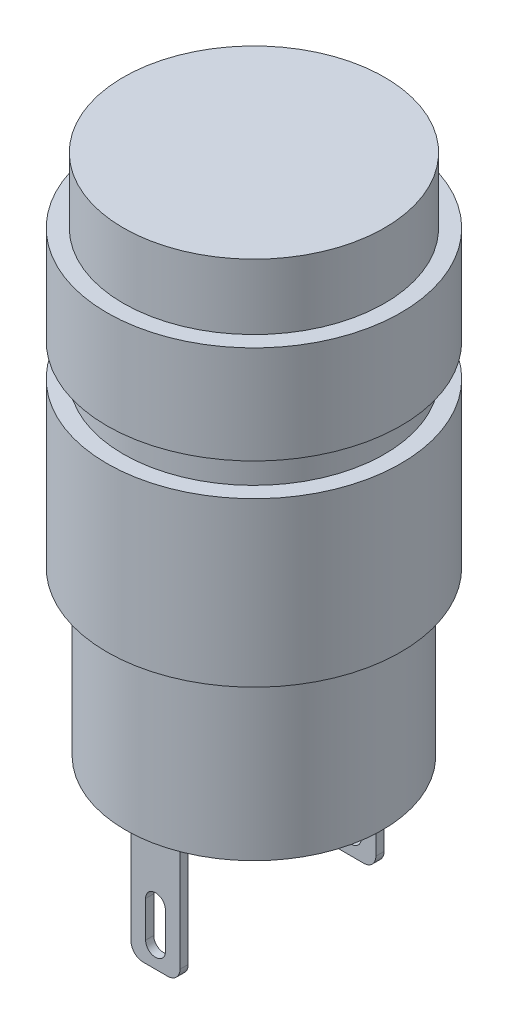
ISO-10303-21;
HEADER;
FILE_DESCRIPTION(('STEP AP214'),'2;1');
FILE_NAME('part.step','',(''),(''),'','','');
FILE_SCHEMA(('AUTOMOTIVE_DESIGN { 1 0 10303 214 1 1 1 1 }'));
ENDSEC;
DATA;
#1=APPLICATION_CONTEXT('core data for automotive mechanical design processes');
#2=APPLICATION_PROTOCOL_DEFINITION('international standard','automotive_design',2000,#1);
#3=PRODUCT_CONTEXT('',#1,'mechanical');
#4=PRODUCT('Part','Part','',(#3));
#5=PRODUCT_RELATED_PRODUCT_CATEGORY('part','',(#4));
#6=PRODUCT_DEFINITION_FORMATION('','',#4);
#7=PRODUCT_DEFINITION_CONTEXT('part definition',#1,'design');
#8=PRODUCT_DEFINITION('design','',#6,#7);
#9=PRODUCT_DEFINITION_SHAPE('','',#8);
#10=(LENGTH_UNIT() NAMED_UNIT(*) SI_UNIT(.MILLI.,.METRE.));
#11=(NAMED_UNIT(*) PLANE_ANGLE_UNIT() SI_UNIT($,.RADIAN.));
#12=(NAMED_UNIT(*) SI_UNIT($,.STERADIAN.) SOLID_ANGLE_UNIT());
#13=UNCERTAINTY_MEASURE_WITH_UNIT(LENGTH_MEASURE(1.E-05),#10,'distance_accuracy_value','');
#14=(GEOMETRIC_REPRESENTATION_CONTEXT(3) GLOBAL_UNCERTAINTY_ASSIGNED_CONTEXT((#13)) GLOBAL_UNIT_ASSIGNED_CONTEXT((#10,
#11,#12)) REPRESENTATION_CONTEXT('',''));
#15=CARTESIAN_POINT('',(0.,0.,0.));
#16=DIRECTION('',(0.,0.,1.));
#17=DIRECTION('',(1.,0.,0.));
#18=AXIS2_PLACEMENT_3D('',#15,#16,#17);
#19=CARTESIAN_POINT('',(0.,20.,0.));
#20=DIRECTION('',(0.,1.,0.));
#21=DIRECTION('',(0.,0.,1.));
#22=AXIS2_PLACEMENT_3D('',#19,#20,#21);
#23=PLANE('',#22);
#24=CARTESIAN_POINT('',(0.,20.,0.));
#25=DIRECTION('',(0.,1.,0.));
#26=DIRECTION('',(0.,0.,1.));
#27=AXIS2_PLACEMENT_3D('',#24,#25,#26);
#28=CIRCLE('',#27,9.);
#29=CARTESIAN_POINT('',(0.,20.,9.));
#30=VERTEX_POINT('',#29);
#31=EDGE_CURVE('E11',#30,#30,#28,.T.);
#32=ORIENTED_EDGE('',*,*,#31,.T.);
#33=EDGE_LOOP('',(#32));
#34=FACE_BOUND('',#33,.T.);
#35=CARTESIAN_POINT('',(0.,20.,0.));
#36=DIRECTION('',(0.,1.,0.));
#37=DIRECTION('',(0.,0.,1.));
#38=AXIS2_PLACEMENT_3D('',#35,#36,#37);
#39=CIRCLE('',#38,8.);
#40=CARTESIAN_POINT('',(0.,20.,8.));
#41=VERTEX_POINT('',#40);
#42=EDGE_CURVE('E59',#41,#41,#39,.T.);
#43=ORIENTED_EDGE('',*,*,#42,.F.);
#44=EDGE_LOOP('',(#43));
#45=FACE_BOUND('',#44,.T.);
#46=ADVANCED_FACE('F48',(#34,#45),#23,.T.);
#47=CARTESIAN_POINT('',(0.,10.,0.));
#48=DIRECTION('',(0.,1.,0.));
#49=DIRECTION('',(0.,0.,1.));
#50=AXIS2_PLACEMENT_3D('',#47,#48,#49);
#51=PLANE('',#50);
#52=CARTESIAN_POINT('',(0.,10.,0.));
#53=DIRECTION('',(0.,1.,0.));
#54=DIRECTION('',(0.,0.,1.));
#55=AXIS2_PLACEMENT_3D('',#52,#53,#54);
#56=CIRCLE('',#55,9.);
#57=CARTESIAN_POINT('',(0.,10.,9.));
#58=VERTEX_POINT('',#57);
#59=EDGE_CURVE('E52',#58,#58,#56,.T.);
#60=ORIENTED_EDGE('',*,*,#59,.F.);
#61=EDGE_LOOP('',(#60));
#62=FACE_BOUND('',#61,.T.);
#63=CARTESIAN_POINT('',(0.,10.,0.));
#64=DIRECTION('',(0.,1.,0.));
#65=DIRECTION('',(0.,0.,1.));
#66=AXIS2_PLACEMENT_3D('',#63,#64,#65);
#67=CIRCLE('',#66,8.);
#68=CARTESIAN_POINT('',(0.,10.,8.));
#69=VERTEX_POINT('',#68);
#70=EDGE_CURVE('E61',#69,#69,#67,.T.);
#71=ORIENTED_EDGE('',*,*,#70,.T.);
#72=EDGE_LOOP('',(#71));
#73=FACE_BOUND('',#72,.T.);
#74=ADVANCED_FACE('F71',(#62,#73),#51,.F.);
#75=CARTESIAN_POINT('',(0.,20.,0.));
#76=DIRECTION('',(0.,-1.,0.));
#77=DIRECTION('',(0.,0.,-1.));
#78=AXIS2_PLACEMENT_3D('',#75,#76,#77);
#79=CYLINDRICAL_SURFACE('',#78,9.);
#80=ORIENTED_EDGE('',*,*,#31,.F.);
#81=EDGE_LOOP('',(#80));
#82=FACE_BOUND('',#81,.T.);
#83=ORIENTED_EDGE('',*,*,#59,.T.);
#84=EDGE_LOOP('',(#83));
#85=FACE_BOUND('',#84,.T.);
#86=ADVANCED_FACE('F50',(#82,#85),#79,.T.);
#87=CARTESIAN_POINT('',(0.,20.,0.));
#88=DIRECTION('',(0.,-1.,0.));
#89=DIRECTION('',(0.,0.,-1.));
#90=AXIS2_PLACEMENT_3D('',#87,#88,#89);
#91=CYLINDRICAL_SURFACE('',#90,8.);
#92=ORIENTED_EDGE('',*,*,#42,.T.);
#93=EDGE_LOOP('',(#92));
#94=FACE_BOUND('',#93,.T.);
#95=ORIENTED_EDGE('',*,*,#70,.F.);
#96=EDGE_LOOP('',(#95));
#97=FACE_BOUND('',#96,.T.);
#98=ADVANCED_FACE('F67',(#94,#97),#91,.F.);
#99=CLOSED_SHELL('',(#46,#74,#86,#98));
#100=MANIFOLD_SOLID_BREP('B2',#99);
#101=CARTESIAN_POINT('',(-1.18951139985828,-8.,-5.65902569259941));
#102=DIRECTION('',(0.,0.,1.));
#103=DIRECTION('',(1.,0.,0.));
#104=AXIS2_PLACEMENT_3D('',#101,#102,#103);
#105=PLANE('',#104);
#106=DIRECTION('',(0.,1.,0.));
#107=VECTOR('',#106,1.);
#108=CARTESIAN_POINT('',(-1.18951139985828,-8.,-5.65902569259941));
#109=LINE('',#108,#107);
#110=CARTESIAN_POINT('',(-1.18951139985828,-7.25,-5.65902569259941));
#111=VERTEX_POINT('',#110);
#112=CARTESIAN_POINT('',(-1.18951139985828,0.,-5.65902569259941));
#113=VERTEX_POINT('',#112);
#114=EDGE_CURVE('E347',#111,#113,#109,.T.);
#115=ORIENTED_EDGE('',*,*,#114,.F.);
#116=CARTESIAN_POINT('',(-0.439511399858283,-7.25,-5.65902569259941));
#117=DIRECTION('',(0.,0.,1.));
#118=DIRECTION('',(1.,0.,0.));
#119=AXIS2_PLACEMENT_3D('',#116,#117,#118);
#120=CIRCLE('',#119,0.75);
#121=CARTESIAN_POINT('',(-0.439511399858283,-8.,-5.65902569259941));
#122=VERTEX_POINT('',#121);
#123=EDGE_CURVE('E392',#111,#122,#120,.T.);
#124=ORIENTED_EDGE('',*,*,#123,.T.);
#125=DIRECTION('',(1.,0.,0.));
#126=VECTOR('',#125,1.);
#127=CARTESIAN_POINT('',(-1.18951139985828,-8.,-5.65902569259941));
#128=LINE('',#127,#126);
#129=CARTESIAN_POINT('',(1.06048860014172,-8.,-5.65902569259941));
#130=VERTEX_POINT('',#129);
#131=EDGE_CURVE('E329',#122,#130,#128,.T.);
#132=ORIENTED_EDGE('',*,*,#131,.T.);
#133=CARTESIAN_POINT('',(1.06048860014172,-7.25,-5.65902569259941));
#134=DIRECTION('',(0.,0.,1.));
#135=DIRECTION('',(1.,0.,0.));
#136=AXIS2_PLACEMENT_3D('',#133,#134,#135);
#137=CIRCLE('',#136,0.75);
#138=CARTESIAN_POINT('',(1.81048860014172,-7.25,-5.65902569259941));
#139=VERTEX_POINT('',#138);
#140=EDGE_CURVE('E390',#130,#139,#137,.T.);
#141=ORIENTED_EDGE('',*,*,#140,.T.);
#142=DIRECTION('',(0.,1.,0.));
#143=VECTOR('',#142,1.);
#144=CARTESIAN_POINT('',(1.81048860014172,-8.,-5.65902569259941));
#145=LINE('',#144,#143);
#146=CARTESIAN_POINT('',(1.81048860014172,0.,-5.65902569259941));
#147=VERTEX_POINT('',#146);
#148=EDGE_CURVE('E344',#139,#147,#145,.T.);
#149=ORIENTED_EDGE('',*,*,#148,.T.);
#150=DIRECTION('',(1.,0.,0.));
#151=VECTOR('',#150,1.);
#152=CARTESIAN_POINT('',(-1.18951139985828,0.,-5.65902569259941));
#153=LINE('',#152,#151);
#154=EDGE_CURVE('E330',#113,#147,#153,.T.);
#155=ORIENTED_EDGE('',*,*,#154,.F.);
#156=EDGE_LOOP('',(#115,#124,#132,#141,#149,#155));
#157=FACE_BOUND('',#156,.T.);
#158=DIRECTION('',(0.,-1.,0.));
#159=VECTOR('',#158,1.);
#160=CARTESIAN_POINT('',(0.917336201535035,-8.,-5.65902569259941));
#161=LINE('',#160,#159);
#162=CARTESIAN_POINT('',(0.917336201535035,-4.54788300792568,-5.65902569259941));
#163=VERTEX_POINT('',#162);
#164=CARTESIAN_POINT('',(0.917336201535035,-6.76015508067386,-5.65902569259941));
#165=VERTEX_POINT('',#164);
#166=EDGE_CURVE('E293',#163,#165,#161,.T.);
#167=ORIENTED_EDGE('',*,*,#166,.T.);
#168=CARTESIAN_POINT('',(0.310488600141718,-6.76015508067386,-5.65902569259941));
#169=DIRECTION('',(0.,0.,1.));
#170=DIRECTION('',(1.,0.,0.));
#171=AXIS2_PLACEMENT_3D('',#168,#169,#170);
#172=CIRCLE('',#171,0.606847601393318);
#173=CARTESIAN_POINT('',(-0.2963590012516,-6.76015508067386,-5.65902569259941));
#174=VERTEX_POINT('',#173);
#175=EDGE_CURVE('E249',#165,#174,#172,.F.);
#176=ORIENTED_EDGE('',*,*,#175,.T.);
#177=DIRECTION('',(0.,1.,0.));
#178=VECTOR('',#177,1.);
#179=CARTESIAN_POINT('',(-0.2963590012516,-8.,-5.65902569259941));
#180=LINE('',#179,#178);
#181=CARTESIAN_POINT('',(-0.2963590012516,-4.54788300792568,-5.65902569259941));
#182=VERTEX_POINT('',#181);
#183=EDGE_CURVE('E281',#174,#182,#180,.T.);
#184=ORIENTED_EDGE('',*,*,#183,.T.);
#185=CARTESIAN_POINT('',(0.310488600141718,-4.54788300792568,-5.65902569259941));
#186=DIRECTION('',(0.,0.,1.));
#187=DIRECTION('',(1.,0.,0.));
#188=AXIS2_PLACEMENT_3D('',#185,#186,#187);
#189=CIRCLE('',#188,0.606847601393318);
#190=EDGE_CURVE('E287',#182,#163,#189,.F.);
#191=ORIENTED_EDGE('',*,*,#190,.T.);
#192=EDGE_LOOP('',(#167,#176,#184,#191));
#193=FACE_BOUND('',#192,.T.);
#194=ADVANCED_FACE('F109',(#157,#193),#105,.T.);
#195=CARTESIAN_POINT('',(-1.18951139985828,-8.,-6.15902569259941));
#196=DIRECTION('',(0.,0.,-1.));
#197=DIRECTION('',(-1.,0.,0.));
#198=AXIS2_PLACEMENT_3D('',#195,#196,#197);
#199=PLANE('',#198);
#200=DIRECTION('',(-1.,0.,0.));
#201=VECTOR('',#200,1.);
#202=CARTESIAN_POINT('',(-1.18951139985828,-8.,-6.15902569259941));
#203=LINE('',#202,#201);
#204=CARTESIAN_POINT('',(1.06048860014172,-8.,-6.15902569259941));
#205=VERTEX_POINT('',#204);
#206=CARTESIAN_POINT('',(-0.439511399858283,-8.,-6.15902569259941));
#207=VERTEX_POINT('',#206);
#208=EDGE_CURVE('E326',#205,#207,#203,.T.);
#209=ORIENTED_EDGE('',*,*,#208,.T.);
#210=CARTESIAN_POINT('',(-0.439511399858283,-7.25,-6.15902569259941));
#211=DIRECTION('',(0.,0.,-1.));
#212=DIRECTION('',(-1.,0.,0.));
#213=AXIS2_PLACEMENT_3D('',#210,#211,#212);
#214=CIRCLE('',#213,0.75);
#215=CARTESIAN_POINT('',(-1.18951139985828,-7.25,-6.15902569259941));
#216=VERTEX_POINT('',#215);
#217=EDGE_CURVE('E400',#207,#216,#214,.T.);
#218=ORIENTED_EDGE('',*,*,#217,.T.);
#219=DIRECTION('',(0.,1.,0.));
#220=VECTOR('',#219,1.);
#221=CARTESIAN_POINT('',(-1.18951139985828,-8.,-6.15902569259941));
#222=LINE('',#221,#220);
#223=CARTESIAN_POINT('',(-1.18951139985828,0.,-6.15902569259941));
#224=VERTEX_POINT('',#223);
#225=EDGE_CURVE('E349',#216,#224,#222,.T.);
#226=ORIENTED_EDGE('',*,*,#225,.T.);
#227=DIRECTION('',(-1.,0.,0.));
#228=VECTOR('',#227,1.);
#229=CARTESIAN_POINT('',(-1.18951139985828,0.,-6.15902569259941));
#230=LINE('',#229,#228);
#231=CARTESIAN_POINT('',(1.81048860014172,0.,-6.15902569259941));
#232=VERTEX_POINT('',#231);
#233=EDGE_CURVE('E336',#232,#224,#230,.T.);
#234=ORIENTED_EDGE('',*,*,#233,.F.);
#235=DIRECTION('',(0.,1.,0.));
#236=VECTOR('',#235,1.);
#237=CARTESIAN_POINT('',(1.81048860014172,-8.,-6.15902569259941));
#238=LINE('',#237,#236);
#239=CARTESIAN_POINT('',(1.81048860014172,-7.25,-6.15902569259941));
#240=VERTEX_POINT('',#239);
#241=EDGE_CURVE('E333',#240,#232,#238,.T.);
#242=ORIENTED_EDGE('',*,*,#241,.F.);
#243=CARTESIAN_POINT('',(1.06048860014172,-7.25,-6.15902569259941));
#244=DIRECTION('',(0.,0.,-1.));
#245=DIRECTION('',(-1.,0.,0.));
#246=AXIS2_PLACEMENT_3D('',#243,#244,#245);
#247=CIRCLE('',#246,0.75);
#248=EDGE_CURVE('E398',#240,#205,#247,.T.);
#249=ORIENTED_EDGE('',*,*,#248,.T.);
#250=EDGE_LOOP('',(#209,#218,#226,#234,#242,#249));
#251=FACE_BOUND('',#250,.T.);
#252=DIRECTION('',(0.,-1.,0.));
#253=VECTOR('',#252,1.);
#254=CARTESIAN_POINT('',(-0.2963590012516,-6.76015508067386,-6.15902569259941));
#255=LINE('',#254,#253);
#256=CARTESIAN_POINT('',(-0.2963590012516,-4.54788300792568,-6.15902569259941));
#257=VERTEX_POINT('',#256);
#258=CARTESIAN_POINT('',(-0.2963590012516,-6.76015508067386,-6.15902569259941));
#259=VERTEX_POINT('',#258);
#260=EDGE_CURVE('E267',#257,#259,#255,.T.);
#261=ORIENTED_EDGE('',*,*,#260,.T.);
#262=CARTESIAN_POINT('',(0.310488600141718,-6.76015508067386,-6.15902569259941));
#263=DIRECTION('',(0.,0.,1.));
#264=DIRECTION('',(1.,0.,0.));
#265=AXIS2_PLACEMENT_3D('',#262,#263,#264);
#266=CIRCLE('',#265,0.606847601393318);
#267=CARTESIAN_POINT('',(0.917336201535035,-6.76015508067386,-6.15902569259941));
#268=VERTEX_POINT('',#267);
#269=EDGE_CURVE('E132',#259,#268,#266,.T.);
#270=ORIENTED_EDGE('',*,*,#269,.T.);
#271=DIRECTION('',(0.,1.,0.));
#272=VECTOR('',#271,1.);
#273=CARTESIAN_POINT('',(0.917336201535035,-6.76015508067386,-6.15902569259941));
#274=LINE('',#273,#272);
#275=CARTESIAN_POINT('',(0.917336201535035,-4.54788300792568,-6.15902569259941));
#276=VERTEX_POINT('',#275);
#277=EDGE_CURVE('E256',#268,#276,#274,.T.);
#278=ORIENTED_EDGE('',*,*,#277,.T.);
#279=CARTESIAN_POINT('',(0.310488600141718,-4.54788300792568,-6.15902569259941));
#280=DIRECTION('',(0.,0.,1.));
#281=DIRECTION('',(1.,0.,0.));
#282=AXIS2_PLACEMENT_3D('',#279,#280,#281);
#283=CIRCLE('',#282,0.606847601393318);
#284=EDGE_CURVE('E263',#276,#257,#283,.T.);
#285=ORIENTED_EDGE('',*,*,#284,.T.);
#286=EDGE_LOOP('',(#261,#270,#278,#285));
#287=FACE_BOUND('',#286,.T.);
#288=ADVANCED_FACE('F266',(#251,#287),#199,.T.);
#289=CARTESIAN_POINT('',(-1.18951139985828,-8.,6.34097430740059));
#290=DIRECTION('',(0.,0.,1.));
#291=DIRECTION('',(1.,0.,0.));
#292=AXIS2_PLACEMENT_3D('',#289,#290,#291);
#293=PLANE('',#292);
#294=DIRECTION('',(0.,1.,0.));
#295=VECTOR('',#294,1.);
#296=CARTESIAN_POINT('',(-1.18951139985828,-8.,6.34097430740059));
#297=LINE('',#296,#295);
#298=CARTESIAN_POINT('',(-1.18951139985828,-7.25,6.34097430740059));
#299=VERTEX_POINT('',#298);
#300=CARTESIAN_POINT('',(-1.18951139985828,0.,6.34097430740059));
#301=VERTEX_POINT('',#300);
#302=EDGE_CURVE('E321',#299,#301,#297,.T.);
#303=ORIENTED_EDGE('',*,*,#302,.F.);
#304=CARTESIAN_POINT('',(-0.439511399858283,-7.25,6.34097430740059));
#305=DIRECTION('',(0.,0.,1.));
#306=DIRECTION('',(1.,0.,0.));
#307=AXIS2_PLACEMENT_3D('',#304,#305,#306);
#308=CIRCLE('',#307,0.75);
#309=CARTESIAN_POINT('',(-0.439511399858283,-8.,6.34097430740059));
#310=VERTEX_POINT('',#309);
#311=EDGE_CURVE('E374',#299,#310,#308,.T.);
#312=ORIENTED_EDGE('',*,*,#311,.T.);
#313=DIRECTION('',(1.,0.,0.));
#314=VECTOR('',#313,1.);
#315=CARTESIAN_POINT('',(-1.18951139985828,-8.,6.34097430740059));
#316=LINE('',#315,#314);
#317=CARTESIAN_POINT('',(1.06048860014172,-8.,6.34097430740059));
#318=VERTEX_POINT('',#317);
#319=EDGE_CURVE('E303',#310,#318,#316,.T.);
#320=ORIENTED_EDGE('',*,*,#319,.T.);
#321=CARTESIAN_POINT('',(1.06048860014172,-7.25,6.34097430740059));
#322=DIRECTION('',(0.,0.,1.));
#323=DIRECTION('',(1.,0.,0.));
#324=AXIS2_PLACEMENT_3D('',#321,#322,#323);
#325=CIRCLE('',#324,0.75);
#326=CARTESIAN_POINT('',(1.81048860014172,-7.25,6.34097430740059));
#327=VERTEX_POINT('',#326);
#328=EDGE_CURVE('E372',#318,#327,#325,.T.);
#329=ORIENTED_EDGE('',*,*,#328,.T.);
#330=DIRECTION('',(0.,1.,0.));
#331=VECTOR('',#330,1.);
#332=CARTESIAN_POINT('',(1.81048860014172,-8.,6.34097430740059));
#333=LINE('',#332,#331);
#334=CARTESIAN_POINT('',(1.81048860014172,0.,6.34097430740059));
#335=VERTEX_POINT('',#334);
#336=EDGE_CURVE('E318',#327,#335,#333,.T.);
#337=ORIENTED_EDGE('',*,*,#336,.T.);
#338=DIRECTION('',(1.,0.,0.));
#339=VECTOR('',#338,1.);
#340=CARTESIAN_POINT('',(-1.18951139985828,0.,6.34097430740059));
#341=LINE('',#340,#339);
#342=EDGE_CURVE('E304',#301,#335,#341,.T.);
#343=ORIENTED_EDGE('',*,*,#342,.F.);
#344=EDGE_LOOP('',(#303,#312,#320,#329,#337,#343));
#345=FACE_BOUND('',#344,.T.);
#346=DIRECTION('',(0.,-1.,0.));
#347=VECTOR('',#346,1.);
#348=CARTESIAN_POINT('',(0.917336201535035,-8.,6.34097430740059));
#349=LINE('',#348,#347);
#350=CARTESIAN_POINT('',(0.917336201535035,-4.54788300792568,6.34097430740059));
#351=VERTEX_POINT('',#350);
#352=CARTESIAN_POINT('',(0.917336201535035,-6.76015508067386,6.34097430740059));
#353=VERTEX_POINT('',#352);
#354=EDGE_CURVE('E290',#351,#353,#349,.T.);
#355=ORIENTED_EDGE('',*,*,#354,.T.);
#356=CARTESIAN_POINT('',(0.310488600141718,-6.76015508067386,6.34097430740059));
#357=DIRECTION('',(0.,0.,1.));
#358=DIRECTION('',(1.,0.,0.));
#359=AXIS2_PLACEMENT_3D('',#356,#357,#358);
#360=CIRCLE('',#359,0.606847601393318);
#361=CARTESIAN_POINT('',(-0.2963590012516,-6.76015508067386,6.34097430740059));
#362=VERTEX_POINT('',#361);
#363=EDGE_CURVE('E295',#353,#362,#360,.F.);
#364=ORIENTED_EDGE('',*,*,#363,.T.);
#365=DIRECTION('',(0.,1.,0.));
#366=VECTOR('',#365,1.);
#367=CARTESIAN_POINT('',(-0.2963590012516,-8.,6.34097430740059));
#368=LINE('',#367,#366);
#369=CARTESIAN_POINT('',(-0.2963590012516,-4.54788300792568,6.34097430740059));
#370=VERTEX_POINT('',#369);
#371=EDGE_CURVE('E278',#362,#370,#368,.T.);
#372=ORIENTED_EDGE('',*,*,#371,.T.);
#373=CARTESIAN_POINT('',(0.310488600141718,-4.54788300792568,6.34097430740059));
#374=DIRECTION('',(0.,0.,1.));
#375=DIRECTION('',(1.,0.,0.));
#376=AXIS2_PLACEMENT_3D('',#373,#374,#375);
#377=CIRCLE('',#376,0.606847601393318);
#378=EDGE_CURVE('E284',#370,#351,#377,.F.);
#379=ORIENTED_EDGE('',*,*,#378,.T.);
#380=EDGE_LOOP('',(#355,#364,#372,#379));
#381=FACE_BOUND('',#380,.T.);
#382=ADVANCED_FACE('F424',(#345,#381),#293,.T.);
#383=CARTESIAN_POINT('',(-1.18951139985828,-8.,5.84097430740059));
#384=DIRECTION('',(0.,0.,-1.));
#385=DIRECTION('',(-1.,0.,0.));
#386=AXIS2_PLACEMENT_3D('',#383,#384,#385);
#387=PLANE('',#386);
#388=DIRECTION('',(-1.,0.,0.));
#389=VECTOR('',#388,1.);
#390=CARTESIAN_POINT('',(-1.18951139985828,-8.,5.84097430740059));
#391=LINE('',#390,#389);
#392=CARTESIAN_POINT('',(1.06048860014172,-8.,5.84097430740059));
#393=VERTEX_POINT('',#392);
#394=CARTESIAN_POINT('',(-0.439511399858283,-8.,5.84097430740059));
#395=VERTEX_POINT('',#394);
#396=EDGE_CURVE('E300',#393,#395,#391,.T.);
#397=ORIENTED_EDGE('',*,*,#396,.T.);
#398=CARTESIAN_POINT('',(-0.439511399858283,-7.25,5.84097430740059));
#399=DIRECTION('',(0.,0.,-1.));
#400=DIRECTION('',(-1.,0.,0.));
#401=AXIS2_PLACEMENT_3D('',#398,#399,#400);
#402=CIRCLE('',#401,0.75);
#403=CARTESIAN_POINT('',(-1.18951139985828,-7.25,5.84097430740059));
#404=VERTEX_POINT('',#403);
#405=EDGE_CURVE('E382',#395,#404,#402,.T.);
#406=ORIENTED_EDGE('',*,*,#405,.T.);
#407=DIRECTION('',(0.,1.,0.));
#408=VECTOR('',#407,1.);
#409=CARTESIAN_POINT('',(-1.18951139985828,-8.,5.84097430740059));
#410=LINE('',#409,#408);
#411=CARTESIAN_POINT('',(-1.18951139985828,0.,5.84097430740059));
#412=VERTEX_POINT('',#411);
#413=EDGE_CURVE('E323',#404,#412,#410,.T.);
#414=ORIENTED_EDGE('',*,*,#413,.T.);
#415=DIRECTION('',(-1.,0.,0.));
#416=VECTOR('',#415,1.);
#417=CARTESIAN_POINT('',(-1.18951139985828,0.,5.84097430740059));
#418=LINE('',#417,#416);
#419=CARTESIAN_POINT('',(1.81048860014172,0.,5.84097430740059));
#420=VERTEX_POINT('',#419);
#421=EDGE_CURVE('E310',#420,#412,#418,.T.);
#422=ORIENTED_EDGE('',*,*,#421,.F.);
#423=DIRECTION('',(0.,1.,0.));
#424=VECTOR('',#423,1.);
#425=CARTESIAN_POINT('',(1.81048860014172,-8.,5.84097430740059));
#426=LINE('',#425,#424);
#427=CARTESIAN_POINT('',(1.81048860014172,-7.25,5.84097430740059));
#428=VERTEX_POINT('',#427);
#429=EDGE_CURVE('E307',#428,#420,#426,.T.);
#430=ORIENTED_EDGE('',*,*,#429,.F.);
#431=CARTESIAN_POINT('',(1.06048860014172,-7.25,5.84097430740059));
#432=DIRECTION('',(0.,0.,-1.));
#433=DIRECTION('',(-1.,0.,0.));
#434=AXIS2_PLACEMENT_3D('',#431,#432,#433);
#435=CIRCLE('',#434,0.75);
#436=EDGE_CURVE('E380',#428,#393,#435,.T.);
#437=ORIENTED_EDGE('',*,*,#436,.T.);
#438=EDGE_LOOP('',(#397,#406,#414,#422,#430,#437));
#439=FACE_BOUND('',#438,.T.);
#440=DIRECTION('',(0.,-1.,0.));
#441=VECTOR('',#440,1.);
#442=CARTESIAN_POINT('',(-0.2963590012516,-8.,5.84097430740059));
#443=LINE('',#442,#441);
#444=CARTESIAN_POINT('',(-0.2963590012516,-4.54788300792568,5.84097430740059));
#445=VERTEX_POINT('',#444);
#446=CARTESIAN_POINT('',(-0.2963590012516,-6.76015508067386,5.84097430740059));
#447=VERTEX_POINT('',#446);
#448=EDGE_CURVE('E405',#445,#447,#443,.T.);
#449=ORIENTED_EDGE('',*,*,#448,.T.);
#450=CARTESIAN_POINT('',(0.310488600141718,-6.76015508067386,5.84097430740059));
#451=DIRECTION('',(0.,0.,-1.));
#452=DIRECTION('',(-1.,0.,0.));
#453=AXIS2_PLACEMENT_3D('',#450,#451,#452);
#454=CIRCLE('',#453,0.606847601393318);
#455=CARTESIAN_POINT('',(0.917336201535035,-6.76015508067386,5.84097430740059));
#456=VERTEX_POINT('',#455);
#457=EDGE_CURVE('E46',#447,#456,#454,.F.);
#458=ORIENTED_EDGE('',*,*,#457,.T.);
#459=DIRECTION('',(0.,1.,0.));
#460=VECTOR('',#459,1.);
#461=CARTESIAN_POINT('',(0.917336201535035,-8.,5.84097430740059));
#462=LINE('',#461,#460);
#463=CARTESIAN_POINT('',(0.917336201535035,-4.54788300792568,5.84097430740059));
#464=VERTEX_POINT('',#463);
#465=EDGE_CURVE('E117',#456,#464,#462,.T.);
#466=ORIENTED_EDGE('',*,*,#465,.T.);
#467=CARTESIAN_POINT('',(0.310488600141718,-4.54788300792568,5.84097430740059));
#468=DIRECTION('',(0.,0.,-1.));
#469=DIRECTION('',(-1.,0.,0.));
#470=AXIS2_PLACEMENT_3D('',#467,#468,#469);
#471=CIRCLE('',#470,0.606847601393318);
#472=EDGE_CURVE('E408',#464,#445,#471,.F.);
#473=ORIENTED_EDGE('',*,*,#472,.T.);
#474=EDGE_LOOP('',(#449,#458,#466,#473));
#475=FACE_BOUND('',#474,.T.);
#476=ADVANCED_FACE('F412',(#439,#475),#387,.T.);
#477=CARTESIAN_POINT('',(0.,22.,0.));
#478=DIRECTION('',(0.,-1.,0.));
#479=DIRECTION('',(0.,0.,-1.));
#480=AXIS2_PLACEMENT_3D('',#477,#478,#479);
#481=CYLINDRICAL_SURFACE('',#480,7.875);
#482=CARTESIAN_POINT('',(0.,22.,0.));
#483=DIRECTION('',(0.,1.,0.));
#484=DIRECTION('',(0.,0.,1.));
#485=AXIS2_PLACEMENT_3D('',#482,#483,#484);
#486=CIRCLE('',#485,7.875);
#487=CARTESIAN_POINT('',(0.,22.,7.875));
#488=VERTEX_POINT('',#487);
#489=EDGE_CURVE('E359',#488,#488,#486,.T.);
#490=ORIENTED_EDGE('',*,*,#489,.F.);
#491=EDGE_LOOP('',(#490));
#492=FACE_BOUND('',#491,.T.);
#493=CARTESIAN_POINT('',(0.,0.,0.));
#494=DIRECTION('',(0.,1.,0.));
#495=DIRECTION('',(0.,0.,1.));
#496=AXIS2_PLACEMENT_3D('',#493,#494,#495);
#497=CIRCLE('',#496,7.875);
#498=CARTESIAN_POINT('',(0.,0.,7.875));
#499=VERTEX_POINT('',#498);
#500=EDGE_CURVE('E363',#499,#499,#497,.T.);
#501=ORIENTED_EDGE('',*,*,#500,.T.);
#502=EDGE_LOOP('',(#501));
#503=FACE_BOUND('',#502,.T.);
#504=ADVANCED_FACE('F488',(#492,#503),#481,.T.);
#505=CARTESIAN_POINT('',(0.,0.,0.));
#506=DIRECTION('',(0.,1.,0.));
#507=DIRECTION('',(0.,0.,1.));
#508=AXIS2_PLACEMENT_3D('',#505,#506,#507);
#509=PLANE('',#508);
#510=ORIENTED_EDGE('',*,*,#342,.T.);
#511=DIRECTION('',(0.,0.,-1.));
#512=VECTOR('',#511,1.);
#513=CARTESIAN_POINT('',(1.81048860014172,0.,6.34097430740059));
#514=LINE('',#513,#512);
#515=EDGE_CURVE('E299',#335,#420,#514,.T.);
#516=ORIENTED_EDGE('',*,*,#515,.T.);
#517=ORIENTED_EDGE('',*,*,#421,.T.);
#518=DIRECTION('',(0.,0.,1.));
#519=VECTOR('',#518,1.);
#520=CARTESIAN_POINT('',(-1.18951139985828,0.,6.34097430740059));
#521=LINE('',#520,#519);
#522=EDGE_CURVE('E313',#412,#301,#521,.T.);
#523=ORIENTED_EDGE('',*,*,#522,.T.);
#524=EDGE_LOOP('',(#510,#516,#517,#523));
#525=FACE_BOUND('',#524,.T.);
#526=ORIENTED_EDGE('',*,*,#154,.T.);
#527=DIRECTION('',(0.,0.,-1.));
#528=VECTOR('',#527,1.);
#529=CARTESIAN_POINT('',(1.81048860014172,0.,-5.65902569259941));
#530=LINE('',#529,#528);
#531=EDGE_CURVE('E320',#147,#232,#530,.T.);
#532=ORIENTED_EDGE('',*,*,#531,.T.);
#533=ORIENTED_EDGE('',*,*,#233,.T.);
#534=DIRECTION('',(0.,0.,1.));
#535=VECTOR('',#534,1.);
#536=CARTESIAN_POINT('',(-1.18951139985828,0.,-5.65902569259941));
#537=LINE('',#536,#535);
#538=EDGE_CURVE('E339',#224,#113,#537,.T.);
#539=ORIENTED_EDGE('',*,*,#538,.T.);
#540=EDGE_LOOP('',(#526,#532,#533,#539));
#541=FACE_BOUND('',#540,.T.);
#542=ORIENTED_EDGE('',*,*,#500,.F.);
#543=EDGE_LOOP('',(#542));
#544=FACE_BOUND('',#543,.T.);
#545=ADVANCED_FACE('F484',(#525,#541,#544),#509,.F.);
#546=CARTESIAN_POINT('',(0.,28.,0.));
#547=DIRECTION('',(0.,-1.,0.));
#548=DIRECTION('',(0.,0.,-1.));
#549=AXIS2_PLACEMENT_3D('',#546,#547,#548);
#550=CYLINDRICAL_SURFACE('',#549,9.);
#551=CARTESIAN_POINT('',(0.,28.,0.));
#552=DIRECTION('',(0.,1.,0.));
#553=DIRECTION('',(0.,0.,1.));
#554=AXIS2_PLACEMENT_3D('',#551,#552,#553);
#555=CIRCLE('',#554,9.);
#556=CARTESIAN_POINT('',(0.,28.,9.));
#557=VERTEX_POINT('',#556);
#558=EDGE_CURVE('E360',#557,#557,#555,.T.);
#559=ORIENTED_EDGE('',*,*,#558,.F.);
#560=EDGE_LOOP('',(#559));
#561=FACE_BOUND('',#560,.T.);
#562=CARTESIAN_POINT('',(0.,22.,0.));
#563=DIRECTION('',(0.,1.,0.));
#564=DIRECTION('',(0.,0.,1.));
#565=AXIS2_PLACEMENT_3D('',#562,#563,#564);
#566=CIRCLE('',#565,9.);
#567=CARTESIAN_POINT('',(0.,22.,9.));
#568=VERTEX_POINT('',#567);
#569=EDGE_CURVE('E354',#568,#568,#566,.T.);
#570=ORIENTED_EDGE('',*,*,#569,.T.);
#571=EDGE_LOOP('',(#570));
#572=FACE_BOUND('',#571,.T.);
#573=ADVANCED_FACE('F477',(#561,#572),#550,.T.);
#574=CARTESIAN_POINT('',(0.,28.,0.));
#575=DIRECTION('',(0.,1.,0.));
#576=DIRECTION('',(0.,0.,1.));
#577=AXIS2_PLACEMENT_3D('',#574,#575,#576);
#578=PLANE('',#577);
#579=CARTESIAN_POINT('',(0.,28.,0.));
#580=DIRECTION('',(0.,1.,0.));
#581=DIRECTION('',(0.,0.,1.));
#582=AXIS2_PLACEMENT_3D('',#579,#580,#581);
#583=CIRCLE('',#582,8.);
#584=CARTESIAN_POINT('',(0.,28.,8.));
#585=VERTEX_POINT('',#584);
#586=EDGE_CURVE('E355',#585,#585,#583,.T.);
#587=ORIENTED_EDGE('',*,*,#586,.F.);
#588=EDGE_LOOP('',(#587));
#589=FACE_BOUND('',#588,.T.);
#590=ORIENTED_EDGE('',*,*,#558,.T.);
#591=EDGE_LOOP('',(#590));
#592=FACE_BOUND('',#591,.T.);
#593=ADVANCED_FACE('F474',(#589,#592),#578,.T.);
#594=CARTESIAN_POINT('',(0.,22.,0.));
#595=DIRECTION('',(0.,1.,0.));
#596=DIRECTION('',(0.,0.,1.));
#597=AXIS2_PLACEMENT_3D('',#594,#595,#596);
#598=PLANE('',#597);
#599=ORIENTED_EDGE('',*,*,#489,.T.);
#600=EDGE_LOOP('',(#599));
#601=FACE_BOUND('',#600,.T.);
#602=ORIENTED_EDGE('',*,*,#569,.F.);
#603=EDGE_LOOP('',(#602));
#604=FACE_BOUND('',#603,.T.);
#605=ADVANCED_FACE('F472',(#601,#604),#598,.F.);
#606=CARTESIAN_POINT('',(0.,32.,0.));
#607=DIRECTION('',(0.,-1.,0.));
#608=DIRECTION('',(0.,0.,-1.));
#609=AXIS2_PLACEMENT_3D('',#606,#607,#608);
#610=CYLINDRICAL_SURFACE('',#609,8.);
#611=CARTESIAN_POINT('',(0.,32.,0.));
#612=DIRECTION('',(0.,1.,0.));
#613=DIRECTION('',(0.,0.,1.));
#614=AXIS2_PLACEMENT_3D('',#611,#612,#613);
#615=CIRCLE('',#614,8.);
#616=CARTESIAN_POINT('',(0.,32.,8.));
#617=VERTEX_POINT('',#616);
#618=EDGE_CURVE('E346',#617,#617,#615,.T.);
#619=ORIENTED_EDGE('',*,*,#618,.F.);
#620=EDGE_LOOP('',(#619));
#621=FACE_BOUND('',#620,.T.);
#622=ORIENTED_EDGE('',*,*,#586,.T.);
#623=EDGE_LOOP('',(#622));
#624=FACE_BOUND('',#623,.T.);
#625=ADVANCED_FACE('F468',(#621,#624),#610,.T.);
#626=CARTESIAN_POINT('',(0.,32.,0.));
#627=DIRECTION('',(0.,1.,0.));
#628=DIRECTION('',(0.,0.,1.));
#629=AXIS2_PLACEMENT_3D('',#626,#627,#628);
#630=PLANE('',#629);
#631=ORIENTED_EDGE('',*,*,#618,.T.);
#632=EDGE_LOOP('',(#631));
#633=FACE_BOUND('',#632,.T.);
#634=ADVANCED_FACE('F464',(#633),#630,.T.);
#635=CARTESIAN_POINT('',(1.81048860014172,-8.,-5.65902569259941));
#636=DIRECTION('',(1.,0.,0.));
#637=DIRECTION('',(0.,0.,-1.));
#638=AXIS2_PLACEMENT_3D('',#635,#636,#637);
#639=PLANE('',#638);
#640=ORIENTED_EDGE('',*,*,#148,.F.);
#641=DIRECTION('',(0.,0.,-1.));
#642=VECTOR('',#641,1.);
#643=CARTESIAN_POINT('',(1.81048860014172,-7.25,-5.65902569259941));
#644=LINE('',#643,#642);
#645=EDGE_CURVE('E402',#139,#240,#644,.T.);
#646=ORIENTED_EDGE('',*,*,#645,.T.);
#647=ORIENTED_EDGE('',*,*,#241,.T.);
#648=ORIENTED_EDGE('',*,*,#531,.F.);
#649=EDGE_LOOP('',(#640,#646,#647,#648));
#650=FACE_BOUND('',#649,.T.);
#651=ADVANCED_FACE('F459',(#650),#639,.T.);
#652=CARTESIAN_POINT('',(-1.18951139985828,-8.,-5.65902569259941));
#653=DIRECTION('',(-1.,0.,0.));
#654=DIRECTION('',(0.,0.,1.));
#655=AXIS2_PLACEMENT_3D('',#652,#653,#654);
#656=PLANE('',#655);
#657=ORIENTED_EDGE('',*,*,#225,.F.);
#658=DIRECTION('',(0.,0.,1.));
#659=VECTOR('',#658,1.);
#660=CARTESIAN_POINT('',(-1.18951139985828,-7.25,-5.65902569259941));
#661=LINE('',#660,#659);
#662=EDGE_CURVE('E387',#216,#111,#661,.T.);
#663=ORIENTED_EDGE('',*,*,#662,.T.);
#664=ORIENTED_EDGE('',*,*,#114,.T.);
#665=ORIENTED_EDGE('',*,*,#538,.F.);
#666=EDGE_LOOP('',(#657,#663,#664,#665));
#667=FACE_BOUND('',#666,.T.);
#668=ADVANCED_FACE('F457',(#667),#656,.T.);
#669=CARTESIAN_POINT('',(0.,-8.,0.));
#670=DIRECTION('',(0.,-1.,0.));
#671=DIRECTION('',(0.,0.,-1.));
#672=AXIS2_PLACEMENT_3D('',#669,#670,#671);
#673=PLANE('',#672);
#674=ORIENTED_EDGE('',*,*,#131,.F.);
#675=DIRECTION('',(0.,0.,1.));
#676=VECTOR('',#675,1.);
#677=CARTESIAN_POINT('',(-0.439511399858283,-8.,0.));
#678=LINE('',#677,#676);
#679=EDGE_CURVE('E396',#122,#207,#678,.F.);
#680=ORIENTED_EDGE('',*,*,#679,.T.);
#681=ORIENTED_EDGE('',*,*,#208,.F.);
#682=DIRECTION('',(0.,0.,-1.));
#683=VECTOR('',#682,1.);
#684=CARTESIAN_POINT('',(1.06048860014172,-8.,0.));
#685=LINE('',#684,#683);
#686=EDGE_CURVE('E394',#205,#130,#685,.F.);
#687=ORIENTED_EDGE('',*,*,#686,.T.);
#688=EDGE_LOOP('',(#674,#680,#681,#687));
#689=FACE_BOUND('',#688,.T.);
#690=ADVANCED_FACE('F455',(#689),#673,.T.);
#691=CARTESIAN_POINT('',(1.81048860014172,-8.,6.34097430740059));
#692=DIRECTION('',(1.,0.,0.));
#693=DIRECTION('',(0.,0.,-1.));
#694=AXIS2_PLACEMENT_3D('',#691,#692,#693);
#695=PLANE('',#694);
#696=ORIENTED_EDGE('',*,*,#336,.F.);
#697=DIRECTION('',(0.,0.,-1.));
#698=VECTOR('',#697,1.);
#699=CARTESIAN_POINT('',(1.81048860014172,-7.25,6.34097430740059));
#700=LINE('',#699,#698);
#701=EDGE_CURVE('E384',#327,#428,#700,.T.);
#702=ORIENTED_EDGE('',*,*,#701,.T.);
#703=ORIENTED_EDGE('',*,*,#429,.T.);
#704=ORIENTED_EDGE('',*,*,#515,.F.);
#705=EDGE_LOOP('',(#696,#702,#703,#704));
#706=FACE_BOUND('',#705,.T.);
#707=ADVANCED_FACE('F524',(#706),#695,.T.);
#708=CARTESIAN_POINT('',(-1.18951139985828,-8.,6.34097430740059));
#709=DIRECTION('',(-1.,0.,0.));
#710=DIRECTION('',(0.,0.,1.));
#711=AXIS2_PLACEMENT_3D('',#708,#709,#710);
#712=PLANE('',#711);
#713=ORIENTED_EDGE('',*,*,#413,.F.);
#714=DIRECTION('',(0.,0.,1.));
#715=VECTOR('',#714,1.);
#716=CARTESIAN_POINT('',(-1.18951139985828,-7.25,6.34097430740059));
#717=LINE('',#716,#715);
#718=EDGE_CURVE('E358',#404,#299,#717,.T.);
#719=ORIENTED_EDGE('',*,*,#718,.T.);
#720=ORIENTED_EDGE('',*,*,#302,.T.);
#721=ORIENTED_EDGE('',*,*,#522,.F.);
#722=EDGE_LOOP('',(#713,#719,#720,#721));
#723=FACE_BOUND('',#722,.T.);
#724=ADVANCED_FACE('F528',(#723),#712,.T.);
#725=CARTESIAN_POINT('',(0.,-8.,0.));
#726=DIRECTION('',(0.,-1.,0.));
#727=DIRECTION('',(0.,0.,-1.));
#728=AXIS2_PLACEMENT_3D('',#725,#726,#727);
#729=PLANE('',#728);
#730=ORIENTED_EDGE('',*,*,#319,.F.);
#731=DIRECTION('',(0.,0.,1.));
#732=VECTOR('',#731,1.);
#733=CARTESIAN_POINT('',(-0.439511399858283,-8.,0.));
#734=LINE('',#733,#732);
#735=EDGE_CURVE('E378',#310,#395,#734,.F.);
#736=ORIENTED_EDGE('',*,*,#735,.T.);
#737=ORIENTED_EDGE('',*,*,#396,.F.);
#738=DIRECTION('',(0.,0.,-1.));
#739=VECTOR('',#738,1.);
#740=CARTESIAN_POINT('',(1.06048860014172,-8.,0.));
#741=LINE('',#740,#739);
#742=EDGE_CURVE('E376',#393,#318,#741,.F.);
#743=ORIENTED_EDGE('',*,*,#742,.T.);
#744=EDGE_LOOP('',(#730,#736,#737,#743));
#745=FACE_BOUND('',#744,.T.);
#746=ADVANCED_FACE('F497',(#745),#729,.T.);
#747=CARTESIAN_POINT('',(-0.439511399858283,-7.25,6.34097430740059));
#748=DIRECTION('',(0.,0.,1.));
#749=DIRECTION('',(1.,0.,0.));
#750=AXIS2_PLACEMENT_3D('',#747,#748,#749);
#751=CYLINDRICAL_SURFACE('',#750,0.75);
#752=ORIENTED_EDGE('',*,*,#405,.F.);
#753=ORIENTED_EDGE('',*,*,#735,.F.);
#754=ORIENTED_EDGE('',*,*,#311,.F.);
#755=ORIENTED_EDGE('',*,*,#718,.F.);
#756=EDGE_LOOP('',(#752,#753,#754,#755));
#757=FACE_BOUND('',#756,.T.);
#758=ADVANCED_FACE('F493',(#757),#751,.T.);
#759=CARTESIAN_POINT('',(1.06048860014172,-7.25,6.34097430740059));
#760=DIRECTION('',(0.,0.,-1.));
#761=DIRECTION('',(-1.,0.,0.));
#762=AXIS2_PLACEMENT_3D('',#759,#760,#761);
#763=CYLINDRICAL_SURFACE('',#762,0.75);
#764=ORIENTED_EDGE('',*,*,#328,.F.);
#765=ORIENTED_EDGE('',*,*,#742,.F.);
#766=ORIENTED_EDGE('',*,*,#436,.F.);
#767=ORIENTED_EDGE('',*,*,#701,.F.);
#768=EDGE_LOOP('',(#764,#765,#766,#767));
#769=FACE_BOUND('',#768,.T.);
#770=ADVANCED_FACE('F496',(#769),#763,.T.);
#771=CARTESIAN_POINT('',(-0.439511399858283,-7.25,-5.65902569259941));
#772=DIRECTION('',(0.,0.,1.));
#773=DIRECTION('',(1.,0.,0.));
#774=AXIS2_PLACEMENT_3D('',#771,#772,#773);
#775=CYLINDRICAL_SURFACE('',#774,0.75);
#776=ORIENTED_EDGE('',*,*,#217,.F.);
#777=ORIENTED_EDGE('',*,*,#679,.F.);
#778=ORIENTED_EDGE('',*,*,#123,.F.);
#779=ORIENTED_EDGE('',*,*,#662,.F.);
#780=EDGE_LOOP('',(#776,#777,#778,#779));
#781=FACE_BOUND('',#780,.T.);
#782=ADVANCED_FACE('F440',(#781),#775,.T.);
#783=CARTESIAN_POINT('',(1.06048860014172,-7.25,-5.65902569259941));
#784=DIRECTION('',(0.,0.,-1.));
#785=DIRECTION('',(-1.,0.,0.));
#786=AXIS2_PLACEMENT_3D('',#783,#784,#785);
#787=CYLINDRICAL_SURFACE('',#786,0.75);
#788=ORIENTED_EDGE('',*,*,#140,.F.);
#789=ORIENTED_EDGE('',*,*,#686,.F.);
#790=ORIENTED_EDGE('',*,*,#248,.F.);
#791=ORIENTED_EDGE('',*,*,#645,.F.);
#792=EDGE_LOOP('',(#788,#789,#790,#791));
#793=FACE_BOUND('',#792,.T.);
#794=ADVANCED_FACE('F111',(#793),#787,.T.);
#795=CARTESIAN_POINT('',(-0.2963590012516,-6.76015508067386,9.));
#796=DIRECTION('',(1.,0.,0.));
#797=DIRECTION('',(0.,1.,0.));
#798=AXIS2_PLACEMENT_3D('',#795,#796,#797);
#799=PLANE('',#798);
#800=DIRECTION('',(0.,0.,-1.));
#801=VECTOR('',#800,1.);
#802=CARTESIAN_POINT('',(-0.2963590012516,-6.76015508067386,9.));
#803=LINE('',#802,#801);
#804=EDGE_CURVE('E274',#362,#447,#803,.T.);
#805=ORIENTED_EDGE('',*,*,#804,.T.);
#806=ORIENTED_EDGE('',*,*,#448,.F.);
#807=DIRECTION('',(0.,0.,-1.));
#808=VECTOR('',#807,1.);
#809=CARTESIAN_POINT('',(-0.2963590012516,-4.54788300792568,9.));
#810=LINE('',#809,#808);
#811=EDGE_CURVE('E276',#370,#445,#810,.T.);
#812=ORIENTED_EDGE('',*,*,#811,.F.);
#813=ORIENTED_EDGE('',*,*,#371,.F.);
#814=EDGE_LOOP('',(#805,#806,#812,#813));
#815=FACE_BOUND('',#814,.T.);
#816=ADVANCED_FACE('F430',(#815),#799,.T.);
#817=CARTESIAN_POINT('',(0.310488600141718,-4.54788300792568,9.));
#818=DIRECTION('',(0.,0.,-1.));
#819=DIRECTION('',(-1.,0.,0.));
#820=AXIS2_PLACEMENT_3D('',#817,#818,#819);
#821=CYLINDRICAL_SURFACE('',#820,0.606847601393318);
#822=ORIENTED_EDGE('',*,*,#811,.T.);
#823=ORIENTED_EDGE('',*,*,#472,.F.);
#824=DIRECTION('',(0.,0.,-1.));
#825=VECTOR('',#824,1.);
#826=CARTESIAN_POINT('',(0.917336201535035,-4.54788300792568,9.));
#827=LINE('',#826,#825);
#828=EDGE_CURVE('E253',#351,#464,#827,.T.);
#829=ORIENTED_EDGE('',*,*,#828,.F.);
#830=ORIENTED_EDGE('',*,*,#378,.F.);
#831=EDGE_LOOP('',(#822,#823,#829,#830));
#832=FACE_BOUND('',#831,.T.);
#833=ADVANCED_FACE('F428',(#832),#821,.F.);
#834=CARTESIAN_POINT('',(0.917336201535035,-6.76015508067386,9.));
#835=DIRECTION('',(-1.,0.,0.));
#836=DIRECTION('',(0.,0.,1.));
#837=AXIS2_PLACEMENT_3D('',#834,#835,#836);
#838=PLANE('',#837);
#839=ORIENTED_EDGE('',*,*,#828,.T.);
#840=ORIENTED_EDGE('',*,*,#465,.F.);
#841=DIRECTION('',(0.,0.,-1.));
#842=VECTOR('',#841,1.);
#843=CARTESIAN_POINT('',(0.917336201535035,-6.76015508067386,9.));
#844=LINE('',#843,#842);
#845=EDGE_CURVE('E252',#353,#456,#844,.T.);
#846=ORIENTED_EDGE('',*,*,#845,.F.);
#847=ORIENTED_EDGE('',*,*,#354,.F.);
#848=EDGE_LOOP('',(#839,#840,#846,#847));
#849=FACE_BOUND('',#848,.T.);
#850=ADVANCED_FACE('F418',(#849),#838,.T.);
#851=CARTESIAN_POINT('',(0.310488600141718,-6.76015508067386,9.));
#852=DIRECTION('',(0.,0.,-1.));
#853=DIRECTION('',(-1.,0.,0.));
#854=AXIS2_PLACEMENT_3D('',#851,#852,#853);
#855=CYLINDRICAL_SURFACE('',#854,0.606847601393318);
#856=ORIENTED_EDGE('',*,*,#845,.T.);
#857=ORIENTED_EDGE('',*,*,#457,.F.);
#858=ORIENTED_EDGE('',*,*,#804,.F.);
#859=ORIENTED_EDGE('',*,*,#363,.F.);
#860=EDGE_LOOP('',(#856,#857,#858,#859));
#861=FACE_BOUND('',#860,.T.);
#862=ADVANCED_FACE('F421',(#861),#855,.F.);
#863=EDGE_CURVE('E245',#165,#268,#844,.T.);
#864=ORIENTED_EDGE('',*,*,#863,.T.);
#865=ORIENTED_EDGE('',*,*,#269,.F.);
#866=EDGE_CURVE('E272',#174,#259,#803,.T.);
#867=ORIENTED_EDGE('',*,*,#866,.F.);
#868=ORIENTED_EDGE('',*,*,#175,.F.);
#869=EDGE_LOOP('',(#864,#865,#867,#868));
#870=FACE_BOUND('',#869,.T.);
#871=ADVANCED_FACE('F247',(#870),#855,.F.);
#872=EDGE_CURVE('E259',#163,#276,#827,.T.);
#873=ORIENTED_EDGE('',*,*,#872,.T.);
#874=ORIENTED_EDGE('',*,*,#277,.F.);
#875=ORIENTED_EDGE('',*,*,#863,.F.);
#876=ORIENTED_EDGE('',*,*,#166,.F.);
#877=EDGE_LOOP('',(#873,#874,#875,#876));
#878=FACE_BOUND('',#877,.T.);
#879=ADVANCED_FACE('F257',(#878),#838,.T.);
#880=EDGE_CURVE('E124',#182,#257,#810,.T.);
#881=ORIENTED_EDGE('',*,*,#880,.T.);
#882=ORIENTED_EDGE('',*,*,#284,.F.);
#883=ORIENTED_EDGE('',*,*,#872,.F.);
#884=ORIENTED_EDGE('',*,*,#190,.F.);
#885=EDGE_LOOP('',(#881,#882,#883,#884));
#886=FACE_BOUND('',#885,.T.);
#887=ADVANCED_FACE('F439',(#886),#821,.F.);
#888=ORIENTED_EDGE('',*,*,#866,.T.);
#889=ORIENTED_EDGE('',*,*,#260,.F.);
#890=ORIENTED_EDGE('',*,*,#880,.F.);
#891=ORIENTED_EDGE('',*,*,#183,.F.);
#892=EDGE_LOOP('',(#888,#889,#890,#891));
#893=FACE_BOUND('',#892,.T.);
#894=ADVANCED_FACE('F433',(#893),#799,.T.);
#895=CLOSED_SHELL('',(#194,#288,#382,#476,#504,#545,#573,#593,#605,#625,#634,#651,#668,#690,
#707,#724,#746,#758,#770,#782,#794,#816,#833,#850,#862,#871,#879,#887,#894));
#896=MANIFOLD_SOLID_BREP('B6',#895);
#897=ADVANCED_BREP_SHAPE_REPRESENTATION('',(#18,#100,#896),#14);
#898=SHAPE_DEFINITION_REPRESENTATION(#9,#897);
ENDSEC;
END-ISO-10303-21;
